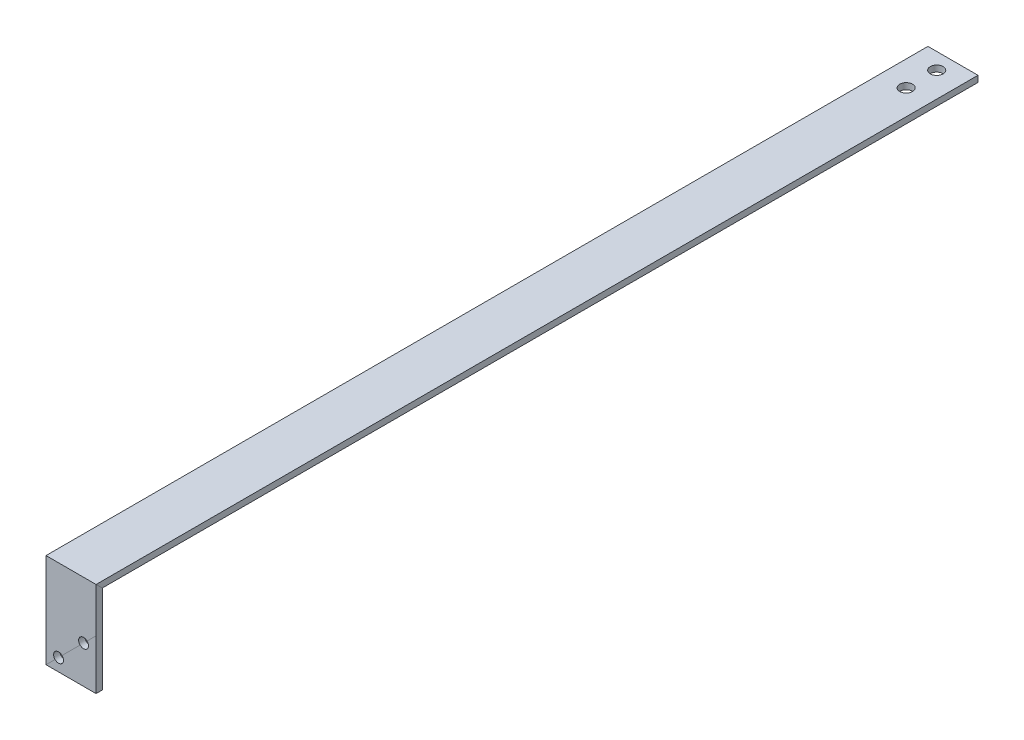
ISO-10303-21;
HEADER;
FILE_DESCRIPTION(('STEP AP214'),'2;1');
FILE_NAME('part.step','',(''),(''),'','','');
FILE_SCHEMA(('AUTOMOTIVE_DESIGN { 1 0 10303 214 1 1 1 1 }'));
ENDSEC;
DATA;
#1=APPLICATION_CONTEXT('core data for automotive mechanical design processes');
#2=APPLICATION_PROTOCOL_DEFINITION('international standard','automotive_design',2000,#1);
#3=PRODUCT_CONTEXT('',#1,'mechanical');
#4=PRODUCT('Part','Part','',(#3));
#5=PRODUCT_RELATED_PRODUCT_CATEGORY('part','',(#4));
#6=PRODUCT_DEFINITION_FORMATION('','',#4);
#7=PRODUCT_DEFINITION_CONTEXT('part definition',#1,'design');
#8=PRODUCT_DEFINITION('design','',#6,#7);
#9=PRODUCT_DEFINITION_SHAPE('','',#8);
#10=(LENGTH_UNIT() NAMED_UNIT(*) SI_UNIT(.MILLI.,.METRE.));
#11=(NAMED_UNIT(*) PLANE_ANGLE_UNIT() SI_UNIT($,.RADIAN.));
#12=(NAMED_UNIT(*) SI_UNIT($,.STERADIAN.) SOLID_ANGLE_UNIT());
#13=UNCERTAINTY_MEASURE_WITH_UNIT(LENGTH_MEASURE(1.E-05),#10,'distance_accuracy_value','');
#14=(GEOMETRIC_REPRESENTATION_CONTEXT(3) GLOBAL_UNCERTAINTY_ASSIGNED_CONTEXT((#13)) GLOBAL_UNIT_ASSIGNED_CONTEXT((#10,
#11,#12)) REPRESENTATION_CONTEXT('',''));
#15=CARTESIAN_POINT('',(0.,0.,0.));
#16=DIRECTION('',(0.,0.,1.));
#17=DIRECTION('',(1.,0.,0.));
#18=AXIS2_PLACEMENT_3D('',#15,#16,#17);
#19=CARTESIAN_POINT('',(0.,0.,0.));
#20=DIRECTION('',(0.,0.,1.));
#21=DIRECTION('',(1.,0.,0.));
#22=AXIS2_PLACEMENT_3D('',#19,#20,#21);
#23=PLANE('',#22);
#24=DIRECTION('',(0.,1.,0.));
#25=VECTOR('',#24,1.);
#26=CARTESIAN_POINT('',(25.4,3.155,0.));
#27=LINE('',#26,#25);
#28=CARTESIAN_POINT('',(25.4,-3.155,0.));
#29=VERTEX_POINT('',#28);
#30=CARTESIAN_POINT('',(25.4,3.155,0.));
#31=VERTEX_POINT('',#30);
#32=EDGE_CURVE('E196',#29,#31,#27,.T.);
#33=ORIENTED_EDGE('',*,*,#32,.F.);
#34=DIRECTION('',(1.,0.,0.));
#35=VECTOR('',#34,1.);
#36=CARTESIAN_POINT('',(-25.4,-3.155,0.));
#37=LINE('',#36,#35);
#38=CARTESIAN_POINT('',(-25.4,-3.155,0.));
#39=VERTEX_POINT('',#38);
#40=EDGE_CURVE('E186',#39,#29,#37,.T.);
#41=ORIENTED_EDGE('',*,*,#40,.F.);
#42=DIRECTION('',(0.,-1.,0.));
#43=VECTOR('',#42,1.);
#44=CARTESIAN_POINT('',(-25.4,3.155,0.));
#45=LINE('',#44,#43);
#46=CARTESIAN_POINT('',(-25.4,3.155,0.));
#47=VERTEX_POINT('',#46);
#48=EDGE_CURVE('E129',#47,#39,#45,.T.);
#49=ORIENTED_EDGE('',*,*,#48,.F.);
#50=DIRECTION('',(-1.,0.,0.));
#51=VECTOR('',#50,1.);
#52=CARTESIAN_POINT('',(-25.4,3.155,0.));
#53=LINE('',#52,#51);
#54=EDGE_CURVE('E193',#31,#47,#53,.T.);
#55=ORIENTED_EDGE('',*,*,#54,.F.);
#56=EDGE_LOOP('',(#33,#41,#49,#55));
#57=FACE_BOUND('',#56,.T.);
#58=ADVANCED_FACE('F33',(#57),#23,.F.);
#59=CARTESIAN_POINT('',(-28.04,-92.78,894.885));
#60=DIRECTION('',(0.,-1.,0.));
#61=DIRECTION('',(0.,0.,-1.));
#62=AXIS2_PLACEMENT_3D('',#59,#60,#61);
#63=PLANE('',#62);
#64=DIRECTION('',(0.,0.,1.));
#65=VECTOR('',#64,1.);
#66=CARTESIAN_POINT('',(25.4,-92.78,884.885));
#67=LINE('',#66,#65);
#68=CARTESIAN_POINT('',(25.4,-92.78,888.575));
#69=VERTEX_POINT('',#68);
#70=CARTESIAN_POINT('',(25.4,-92.78,894.885));
#71=VERTEX_POINT('',#70);
#72=EDGE_CURVE('E225',#69,#71,#67,.T.);
#73=ORIENTED_EDGE('',*,*,#72,.T.);
#74=DIRECTION('',(1.,0.,0.));
#75=VECTOR('',#74,1.);
#76=CARTESIAN_POINT('',(-28.04,-92.78,894.885));
#77=LINE('',#76,#75);
#78=CARTESIAN_POINT('',(-25.4,-92.78,894.885));
#79=VERTEX_POINT('',#78);
#80=EDGE_CURVE('E143',#79,#71,#77,.T.);
#81=ORIENTED_EDGE('',*,*,#80,.F.);
#82=DIRECTION('',(0.,0.,1.));
#83=VECTOR('',#82,1.);
#84=CARTESIAN_POINT('',(-25.4,-92.78,894.885));
#85=LINE('',#84,#83);
#86=CARTESIAN_POINT('',(-25.4,-92.78,888.575));
#87=VERTEX_POINT('',#86);
#88=EDGE_CURVE('E152',#87,#79,#85,.T.);
#89=ORIENTED_EDGE('',*,*,#88,.F.);
#90=DIRECTION('',(1.,0.,0.));
#91=VECTOR('',#90,1.);
#92=CARTESIAN_POINT('',(-28.04,-92.78,888.575));
#93=LINE('',#92,#91);
#94=EDGE_CURVE('E155',#87,#69,#93,.T.);
#95=ORIENTED_EDGE('',*,*,#94,.T.);
#96=EDGE_LOOP('',(#73,#81,#89,#95));
#97=FACE_BOUND('',#96,.T.);
#98=ADVANCED_FACE('F220',(#97),#63,.T.);
#99=CARTESIAN_POINT('',(-28.04,-92.78,888.575));
#100=DIRECTION('',(0.,0.,-1.));
#101=DIRECTION('',(-1.,0.,0.));
#102=AXIS2_PLACEMENT_3D('',#99,#100,#101);
#103=PLANE('',#102);
#104=CARTESIAN_POINT('',(-12.7,-80.08,888.575));
#105=DIRECTION('',(0.,0.,-1.));
#106=DIRECTION('',(-1.,0.,0.));
#107=AXIS2_PLACEMENT_3D('',#104,#105,#106);
#108=CIRCLE('',#107,5.);
#109=CARTESIAN_POINT('',(-9.16446609406726,-76.5444660940673,888.575));
#110=VERTEX_POINT('',#109);
#111=CARTESIAN_POINT('',(-16.2355339059327,-83.6155339059327,888.575));
#112=VERTEX_POINT('',#111);
#113=EDGE_CURVE('E52',#110,#112,#108,.T.);
#114=ORIENTED_EDGE('',*,*,#113,.F.);
#115=DIRECTION('',(-0.707106781186548,-0.707106781186548,0.));
#116=VECTOR('',#115,1.);
#117=CARTESIAN_POINT('',(22.7752499999999,-44.6047500000001,888.575));
#118=LINE('',#117,#116);
#119=CARTESIAN_POINT('',(9.16446609406726,-58.2155339059327,888.575));
#120=VERTEX_POINT('',#119);
#121=EDGE_CURVE('E119',#120,#110,#118,.T.);
#122=ORIENTED_EDGE('',*,*,#121,.F.);
#123=CARTESIAN_POINT('',(12.7,-54.68,888.575));
#124=DIRECTION('',(0.,0.,-1.));
#125=DIRECTION('',(-1.,0.,0.));
#126=AXIS2_PLACEMENT_3D('',#123,#124,#125);
#127=CIRCLE('',#126,5.);
#128=CARTESIAN_POINT('',(16.2355339059327,-51.1444660940673,888.575));
#129=VERTEX_POINT('',#128);
#130=EDGE_CURVE('E237',#129,#120,#127,.T.);
#131=ORIENTED_EDGE('',*,*,#130,.F.);
#132=CARTESIAN_POINT('',(25.4,-41.98,888.575));
#133=VERTEX_POINT('',#132);
#134=EDGE_CURVE('E127',#133,#129,#118,.T.);
#135=ORIENTED_EDGE('',*,*,#134,.F.);
#136=DIRECTION('',(0.,1.,0.));
#137=VECTOR('',#136,1.);
#138=CARTESIAN_POINT('',(25.4,-92.78,888.575));
#139=LINE('',#138,#137);
#140=EDGE_CURVE('E223',#69,#133,#139,.T.);
#141=ORIENTED_EDGE('',*,*,#140,.F.);
#142=ORIENTED_EDGE('',*,*,#94,.F.);
#143=EDGE_CURVE('E121',#112,#87,#118,.T.);
#144=ORIENTED_EDGE('',*,*,#143,.F.);
#145=EDGE_LOOP('',(#114,#122,#131,#135,#141,#142,#144));
#146=FACE_BOUND('',#145,.T.);
#147=ADVANCED_FACE('F117',(#146),#103,.T.);
#148=CARTESIAN_POINT('',(-28.04,-92.78,894.885));
#149=DIRECTION('',(0.,0.,1.));
#150=DIRECTION('',(1.,0.,0.));
#151=AXIS2_PLACEMENT_3D('',#148,#149,#150);
#152=PLANE('',#151);
#153=CARTESIAN_POINT('',(-12.7,-80.08,894.885));
#154=DIRECTION('',(0.,0.,1.));
#155=DIRECTION('',(1.,0.,0.));
#156=AXIS2_PLACEMENT_3D('',#153,#154,#155);
#157=CIRCLE('',#156,5.);
#158=CARTESIAN_POINT('',(-16.2355339059327,-83.6155339059327,894.885));
#159=VERTEX_POINT('',#158);
#160=CARTESIAN_POINT('',(-9.16446609406727,-76.5444660940673,894.885));
#161=VERTEX_POINT('',#160);
#162=EDGE_CURVE('E46',#159,#161,#157,.T.);
#163=ORIENTED_EDGE('',*,*,#162,.F.);
#164=DIRECTION('',(0.707106781186548,0.707106781186548,0.));
#165=VECTOR('',#164,1.);
#166=CARTESIAN_POINT('',(22.7752499999999,-44.6047500000001,894.885));
#167=LINE('',#166,#165);
#168=EDGE_CURVE('E130',#79,#159,#167,.T.);
#169=ORIENTED_EDGE('',*,*,#168,.F.);
#170=ORIENTED_EDGE('',*,*,#80,.T.);
#171=DIRECTION('',(0.,-1.,0.));
#172=VECTOR('',#171,1.);
#173=CARTESIAN_POINT('',(25.4,-41.98,894.885));
#174=LINE('',#173,#172);
#175=CARTESIAN_POINT('',(25.4,-41.98,894.885));
#176=VERTEX_POINT('',#175);
#177=EDGE_CURVE('E228',#176,#71,#174,.T.);
#178=ORIENTED_EDGE('',*,*,#177,.F.);
#179=CARTESIAN_POINT('',(16.2355339059327,-51.1444660940673,894.885));
#180=VERTEX_POINT('',#179);
#181=EDGE_CURVE('E138',#180,#176,#167,.T.);
#182=ORIENTED_EDGE('',*,*,#181,.F.);
#183=CARTESIAN_POINT('',(12.7,-54.68,894.885));
#184=DIRECTION('',(0.,0.,1.));
#185=DIRECTION('',(1.,0.,0.));
#186=AXIS2_PLACEMENT_3D('',#183,#184,#185);
#187=CIRCLE('',#186,5.);
#188=CARTESIAN_POINT('',(9.16446609406726,-58.2155339059327,894.885));
#189=VERTEX_POINT('',#188);
#190=EDGE_CURVE('E232',#189,#180,#187,.T.);
#191=ORIENTED_EDGE('',*,*,#190,.F.);
#192=EDGE_CURVE('E137',#161,#189,#167,.T.);
#193=ORIENTED_EDGE('',*,*,#192,.F.);
#194=EDGE_LOOP('',(#163,#169,#170,#178,#182,#191,#193));
#195=FACE_BOUND('',#194,.T.);
#196=ADVANCED_FACE('F243',(#195),#152,.T.);
#197=CARTESIAN_POINT('',(-25.4,3.57049999999988,894.885));
#198=DIRECTION('',(0.,0.,1.));
#199=DIRECTION('',(1.,0.,0.));
#200=AXIS2_PLACEMENT_3D('',#197,#198,#199);
#201=PLANE('',#200);
#202=CARTESIAN_POINT('',(-12.7,-80.08,894.885));
#203=DIRECTION('',(0.,0.,1.));
#204=DIRECTION('',(1.,0.,0.));
#205=AXIS2_PLACEMENT_3D('',#202,#203,#204);
#206=CIRCLE('',#205,5.);
#207=EDGE_CURVE('E122',#161,#159,#206,.T.);
#208=ORIENTED_EDGE('',*,*,#207,.F.);
#209=ORIENTED_EDGE('',*,*,#192,.T.);
#210=CARTESIAN_POINT('',(12.7,-54.68,894.885));
#211=DIRECTION('',(0.,0.,1.));
#212=DIRECTION('',(1.,0.,0.));
#213=AXIS2_PLACEMENT_3D('',#210,#211,#212);
#214=CIRCLE('',#213,5.);
#215=EDGE_CURVE('E234',#180,#189,#214,.T.);
#216=ORIENTED_EDGE('',*,*,#215,.F.);
#217=ORIENTED_EDGE('',*,*,#181,.T.);
#218=DIRECTION('',(0.,-1.,0.));
#219=VECTOR('',#218,1.);
#220=CARTESIAN_POINT('',(25.4,3.57049999999988,894.885));
#221=LINE('',#220,#219);
#222=CARTESIAN_POINT('',(25.4,3.155,894.885));
#223=VERTEX_POINT('',#222);
#224=EDGE_CURVE('E139',#223,#176,#221,.T.);
#225=ORIENTED_EDGE('',*,*,#224,.F.);
#226=DIRECTION('',(1.,0.,0.));
#227=VECTOR('',#226,1.);
#228=CARTESIAN_POINT('',(-25.4,3.155,894.885));
#229=LINE('',#228,#227);
#230=CARTESIAN_POINT('',(-25.4,3.155,894.885));
#231=VERTEX_POINT('',#230);
#232=EDGE_CURVE('E177',#231,#223,#229,.T.);
#233=ORIENTED_EDGE('',*,*,#232,.F.);
#234=DIRECTION('',(0.,-1.,0.));
#235=VECTOR('',#234,1.);
#236=CARTESIAN_POINT('',(-25.4,3.57049999999988,894.885));
#237=LINE('',#236,#235);
#238=EDGE_CURVE('E149',#231,#79,#237,.T.);
#239=ORIENTED_EDGE('',*,*,#238,.T.);
#240=ORIENTED_EDGE('',*,*,#168,.T.);
#241=EDGE_LOOP('',(#208,#209,#216,#217,#225,#233,#239,#240));
#242=FACE_BOUND('',#241,.T.);
#243=ADVANCED_FACE('F245',(#242),#201,.T.);
#244=CARTESIAN_POINT('',(25.4,3.57049999999988,894.885));
#245=DIRECTION('',(1.,0.,0.));
#246=DIRECTION('',(0.,0.,-1.));
#247=AXIS2_PLACEMENT_3D('',#244,#245,#246);
#248=PLANE('',#247);
#249=ORIENTED_EDGE('',*,*,#224,.T.);
#250=ORIENTED_EDGE('',*,*,#177,.T.);
#251=ORIENTED_EDGE('',*,*,#72,.F.);
#252=ORIENTED_EDGE('',*,*,#140,.T.);
#253=DIRECTION('',(0.,-1.,0.));
#254=VECTOR('',#253,1.);
#255=CARTESIAN_POINT('',(25.4,3.57049999999988,888.575));
#256=LINE('',#255,#254);
#257=CARTESIAN_POINT('',(25.4,-3.15500000000007,888.575));
#258=VERTEX_POINT('',#257);
#259=EDGE_CURVE('E142',#258,#133,#256,.T.);
#260=ORIENTED_EDGE('',*,*,#259,.F.);
#261=DIRECTION('',(0.,-0.707106781186548,-0.707106781186548));
#262=VECTOR('',#261,1.);
#263=CARTESIAN_POINT('',(25.4,-444.2875,447.4425));
#264=LINE('',#263,#262);
#265=EDGE_CURVE('E170',#223,#258,#264,.T.);
#266=ORIENTED_EDGE('',*,*,#265,.F.);
#267=EDGE_LOOP('',(#249,#250,#251,#252,#260,#266));
#268=FACE_BOUND('',#267,.T.);
#269=ADVANCED_FACE('F272',(#268),#248,.T.);
#270=CARTESIAN_POINT('',(-25.4,3.57049999999988,888.575));
#271=DIRECTION('',(0.,0.,-1.));
#272=DIRECTION('',(-1.,0.,0.));
#273=AXIS2_PLACEMENT_3D('',#270,#271,#272);
#274=PLANE('',#273);
#275=CARTESIAN_POINT('',(-12.7,-80.08,888.575));
#276=DIRECTION('',(0.,0.,-1.));
#277=DIRECTION('',(-1.,0.,0.));
#278=AXIS2_PLACEMENT_3D('',#275,#276,#277);
#279=CIRCLE('',#278,5.);
#280=EDGE_CURVE('E11',#112,#110,#279,.T.);
#281=ORIENTED_EDGE('',*,*,#280,.F.);
#282=ORIENTED_EDGE('',*,*,#143,.T.);
#283=DIRECTION('',(0.,-1.,0.));
#284=VECTOR('',#283,1.);
#285=CARTESIAN_POINT('',(-25.4,3.57049999999988,888.575));
#286=LINE('',#285,#284);
#287=CARTESIAN_POINT('',(-25.4,-3.15500000000004,888.575));
#288=VERTEX_POINT('',#287);
#289=EDGE_CURVE('E146',#288,#87,#286,.T.);
#290=ORIENTED_EDGE('',*,*,#289,.F.);
#291=DIRECTION('',(-1.,0.,0.));
#292=VECTOR('',#291,1.);
#293=CARTESIAN_POINT('',(-25.4,-3.155,888.575));
#294=LINE('',#293,#292);
#295=EDGE_CURVE('E167',#258,#288,#294,.T.);
#296=ORIENTED_EDGE('',*,*,#295,.F.);
#297=ORIENTED_EDGE('',*,*,#259,.T.);
#298=ORIENTED_EDGE('',*,*,#134,.T.);
#299=CARTESIAN_POINT('',(12.7,-54.68,888.575));
#300=DIRECTION('',(0.,0.,-1.));
#301=DIRECTION('',(-1.,0.,0.));
#302=AXIS2_PLACEMENT_3D('',#299,#300,#301);
#303=CIRCLE('',#302,5.);
#304=EDGE_CURVE('E40',#120,#129,#303,.T.);
#305=ORIENTED_EDGE('',*,*,#304,.F.);
#306=ORIENTED_EDGE('',*,*,#121,.T.);
#307=EDGE_LOOP('',(#281,#282,#290,#296,#297,#298,#305,#306));
#308=FACE_BOUND('',#307,.T.);
#309=ADVANCED_FACE('F125',(#308),#274,.T.);
#310=CARTESIAN_POINT('',(-25.4,3.57049999999988,894.885));
#311=DIRECTION('',(-1.,0.,0.));
#312=DIRECTION('',(0.,0.,1.));
#313=AXIS2_PLACEMENT_3D('',#310,#311,#312);
#314=PLANE('',#313);
#315=ORIENTED_EDGE('',*,*,#289,.T.);
#316=ORIENTED_EDGE('',*,*,#88,.T.);
#317=ORIENTED_EDGE('',*,*,#238,.F.);
#318=DIRECTION('',(0.,0.707106781186548,0.707106781186548));
#319=VECTOR('',#318,1.);
#320=CARTESIAN_POINT('',(-25.4,-444.2875,447.4425));
#321=LINE('',#320,#319);
#322=EDGE_CURVE('E133',#288,#231,#321,.T.);
#323=ORIENTED_EDGE('',*,*,#322,.F.);
#324=EDGE_LOOP('',(#315,#316,#317,#323));
#325=FACE_BOUND('',#324,.T.);
#326=ADVANCED_FACE('F214',(#325),#314,.T.);
#327=CARTESIAN_POINT('',(-25.4,3.155,0.));
#328=DIRECTION('',(0.,1.,0.));
#329=DIRECTION('',(0.,0.,1.));
#330=AXIS2_PLACEMENT_3D('',#327,#328,#329);
#331=PLANE('',#330);
#332=CARTESIAN_POINT('',(7.60438045407218E-12,3.155,47.5000000000025));
#333=DIRECTION('',(0.,1.,0.));
#334=DIRECTION('',(0.,0.,1.));
#335=AXIS2_PLACEMENT_3D('',#332,#333,#334);
#336=CIRCLE('',#335,6.50000000000021);
#337=CARTESIAN_POINT('',(7.60438045407218E-12,3.155,54.0000000000027));
#338=VERTEX_POINT('',#337);
#339=EDGE_CURVE('E166',#338,#338,#336,.T.);
#340=ORIENTED_EDGE('',*,*,#339,.F.);
#341=EDGE_LOOP('',(#340));
#342=FACE_BOUND('',#341,.T.);
#343=CARTESIAN_POINT('',(7.49614453256804E-12,3.155,16.5000000000025));
#344=DIRECTION('',(0.,1.,0.));
#345=DIRECTION('',(0.,0.,1.));
#346=AXIS2_PLACEMENT_3D('',#343,#344,#345);
#347=CIRCLE('',#346,6.50000000000021);
#348=CARTESIAN_POINT('',(7.49614453256804E-12,3.155,23.0000000000027));
#349=VERTEX_POINT('',#348);
#350=EDGE_CURVE('E163',#349,#349,#347,.T.);
#351=ORIENTED_EDGE('',*,*,#350,.F.);
#352=EDGE_LOOP('',(#351));
#353=FACE_BOUND('',#352,.T.);
#354=DIRECTION('',(0.,0.,1.));
#355=VECTOR('',#354,1.);
#356=CARTESIAN_POINT('',(-25.4,3.155,0.));
#357=LINE('',#356,#355);
#358=EDGE_CURVE('E190',#47,#231,#357,.T.);
#359=ORIENTED_EDGE('',*,*,#358,.T.);
#360=ORIENTED_EDGE('',*,*,#232,.T.);
#361=DIRECTION('',(0.,0.,1.));
#362=VECTOR('',#361,1.);
#363=CARTESIAN_POINT('',(25.4,3.155,0.));
#364=LINE('',#363,#362);
#365=EDGE_CURVE('E198',#31,#223,#364,.T.);
#366=ORIENTED_EDGE('',*,*,#365,.F.);
#367=ORIENTED_EDGE('',*,*,#54,.T.);
#368=EDGE_LOOP('',(#359,#360,#366,#367));
#369=FACE_BOUND('',#368,.T.);
#370=ADVANCED_FACE('F206',(#342,#353,#369),#331,.T.);
#371=CARTESIAN_POINT('',(25.4,3.155,0.));
#372=DIRECTION('',(1.,0.,0.));
#373=DIRECTION('',(0.,0.,-1.));
#374=AXIS2_PLACEMENT_3D('',#371,#372,#373);
#375=PLANE('',#374);
#376=ORIENTED_EDGE('',*,*,#365,.T.);
#377=ORIENTED_EDGE('',*,*,#265,.T.);
#378=DIRECTION('',(0.,0.,1.));
#379=VECTOR('',#378,1.);
#380=CARTESIAN_POINT('',(25.4,-3.155,0.));
#381=LINE('',#380,#379);
#382=EDGE_CURVE('E189',#29,#258,#381,.T.);
#383=ORIENTED_EDGE('',*,*,#382,.F.);
#384=ORIENTED_EDGE('',*,*,#32,.T.);
#385=EDGE_LOOP('',(#376,#377,#383,#384));
#386=FACE_BOUND('',#385,.T.);
#387=ADVANCED_FACE('F248',(#386),#375,.T.);
#388=CARTESIAN_POINT('',(-25.4,-3.155,0.));
#389=DIRECTION('',(0.,-1.,0.));
#390=DIRECTION('',(0.,0.,-1.));
#391=AXIS2_PLACEMENT_3D('',#388,#389,#390);
#392=PLANE('',#391);
#393=CARTESIAN_POINT('',(7.60438045407218E-12,-3.155,47.5000000000025));
#394=DIRECTION('',(0.,-1.,0.));
#395=DIRECTION('',(0.,0.,-1.));
#396=AXIS2_PLACEMENT_3D('',#393,#394,#395);
#397=CIRCLE('',#396,6.50000000000021);
#398=CARTESIAN_POINT('',(7.60438045407218E-12,-3.155,41.0000000000023));
#399=VERTEX_POINT('',#398);
#400=EDGE_CURVE('E164',#399,#399,#397,.T.);
#401=ORIENTED_EDGE('',*,*,#400,.F.);
#402=EDGE_LOOP('',(#401));
#403=FACE_BOUND('',#402,.T.);
#404=CARTESIAN_POINT('',(7.49614453256804E-12,-3.155,16.5000000000025));
#405=DIRECTION('',(0.,-1.,0.));
#406=DIRECTION('',(0.,0.,-1.));
#407=AXIS2_PLACEMENT_3D('',#404,#405,#406);
#408=CIRCLE('',#407,6.50000000000021);
#409=CARTESIAN_POINT('',(7.49614453256804E-12,-3.155,10.0000000000023));
#410=VERTEX_POINT('',#409);
#411=EDGE_CURVE('E158',#410,#410,#408,.T.);
#412=ORIENTED_EDGE('',*,*,#411,.F.);
#413=EDGE_LOOP('',(#412));
#414=FACE_BOUND('',#413,.T.);
#415=ORIENTED_EDGE('',*,*,#382,.T.);
#416=ORIENTED_EDGE('',*,*,#295,.T.);
#417=DIRECTION('',(0.,0.,1.));
#418=VECTOR('',#417,1.);
#419=CARTESIAN_POINT('',(-25.4,-3.155,0.));
#420=LINE('',#419,#418);
#421=EDGE_CURVE('E187',#39,#288,#420,.T.);
#422=ORIENTED_EDGE('',*,*,#421,.F.);
#423=ORIENTED_EDGE('',*,*,#40,.T.);
#424=EDGE_LOOP('',(#415,#416,#422,#423));
#425=FACE_BOUND('',#424,.T.);
#426=ADVANCED_FACE('F250',(#403,#414,#425),#392,.T.);
#427=CARTESIAN_POINT('',(-25.4,3.155,0.));
#428=DIRECTION('',(-1.,0.,0.));
#429=DIRECTION('',(0.,0.,1.));
#430=AXIS2_PLACEMENT_3D('',#427,#428,#429);
#431=PLANE('',#430);
#432=ORIENTED_EDGE('',*,*,#421,.T.);
#433=ORIENTED_EDGE('',*,*,#322,.T.);
#434=ORIENTED_EDGE('',*,*,#358,.F.);
#435=ORIENTED_EDGE('',*,*,#48,.T.);
#436=EDGE_LOOP('',(#432,#433,#434,#435));
#437=FACE_BOUND('',#436,.T.);
#438=ADVANCED_FACE('F210',(#437),#431,.T.);
#439=CARTESIAN_POINT('',(7.49614453256804E-12,-6.845,16.5000000000025));
#440=DIRECTION('',(0.,1.,0.));
#441=DIRECTION('',(0.,0.,1.));
#442=AXIS2_PLACEMENT_3D('',#439,#440,#441);
#443=CYLINDRICAL_SURFACE('',#442,6.50000000000021);
#444=ORIENTED_EDGE('',*,*,#411,.T.);
#445=EDGE_LOOP('',(#444));
#446=FACE_BOUND('',#445,.T.);
#447=ORIENTED_EDGE('',*,*,#350,.T.);
#448=EDGE_LOOP('',(#447));
#449=FACE_BOUND('',#448,.T.);
#450=ADVANCED_FACE('F258',(#446,#449),#443,.F.);
#451=CARTESIAN_POINT('',(7.60438045407218E-12,-6.845,47.5000000000025));
#452=DIRECTION('',(0.,1.,0.));
#453=DIRECTION('',(0.,0.,1.));
#454=AXIS2_PLACEMENT_3D('',#451,#452,#453);
#455=CYLINDRICAL_SURFACE('',#454,6.50000000000021);
#456=ORIENTED_EDGE('',*,*,#400,.T.);
#457=EDGE_LOOP('',(#456));
#458=FACE_BOUND('',#457,.T.);
#459=ORIENTED_EDGE('',*,*,#339,.T.);
#460=EDGE_LOOP('',(#459));
#461=FACE_BOUND('',#460,.T.);
#462=ADVANCED_FACE('F302',(#458,#461),#455,.F.);
#463=CARTESIAN_POINT('',(12.7,-54.68,898.575));
#464=DIRECTION('',(0.,0.,-1.));
#465=DIRECTION('',(-1.,0.,0.));
#466=AXIS2_PLACEMENT_3D('',#463,#464,#465);
#467=CYLINDRICAL_SURFACE('',#466,5.);
#468=ORIENTED_EDGE('',*,*,#190,.T.);
#469=ORIENTED_EDGE('',*,*,#215,.T.);
#470=EDGE_LOOP('',(#468,#469));
#471=FACE_BOUND('',#470,.T.);
#472=ORIENTED_EDGE('',*,*,#130,.T.);
#473=ORIENTED_EDGE('',*,*,#304,.T.);
#474=EDGE_LOOP('',(#472,#473));
#475=FACE_BOUND('',#474,.T.);
#476=ADVANCED_FACE('F297',(#471,#475),#467,.F.);
#477=CARTESIAN_POINT('',(-12.7,-80.08,898.575));
#478=DIRECTION('',(0.,0.,-1.));
#479=DIRECTION('',(-1.,0.,0.));
#480=AXIS2_PLACEMENT_3D('',#477,#478,#479);
#481=CYLINDRICAL_SURFACE('',#480,5.);
#482=ORIENTED_EDGE('',*,*,#162,.T.);
#483=ORIENTED_EDGE('',*,*,#207,.T.);
#484=EDGE_LOOP('',(#482,#483));
#485=FACE_BOUND('',#484,.T.);
#486=ORIENTED_EDGE('',*,*,#113,.T.);
#487=ORIENTED_EDGE('',*,*,#280,.T.);
#488=EDGE_LOOP('',(#486,#487));
#489=FACE_BOUND('',#488,.T.);
#490=ADVANCED_FACE('F111',(#485,#489),#481,.F.);
#491=CLOSED_SHELL('',(#58,#98,#147,#196,#243,#269,#309,#326,#370,#387,#426,#438,#450,#462,#476,#490));
#492=MANIFOLD_SOLID_BREP('B2',#491);
#493=ADVANCED_BREP_SHAPE_REPRESENTATION('',(#18,#492),#14);
#494=SHAPE_DEFINITION_REPRESENTATION(#9,#493);
ENDSEC;
END-ISO-10303-21;
